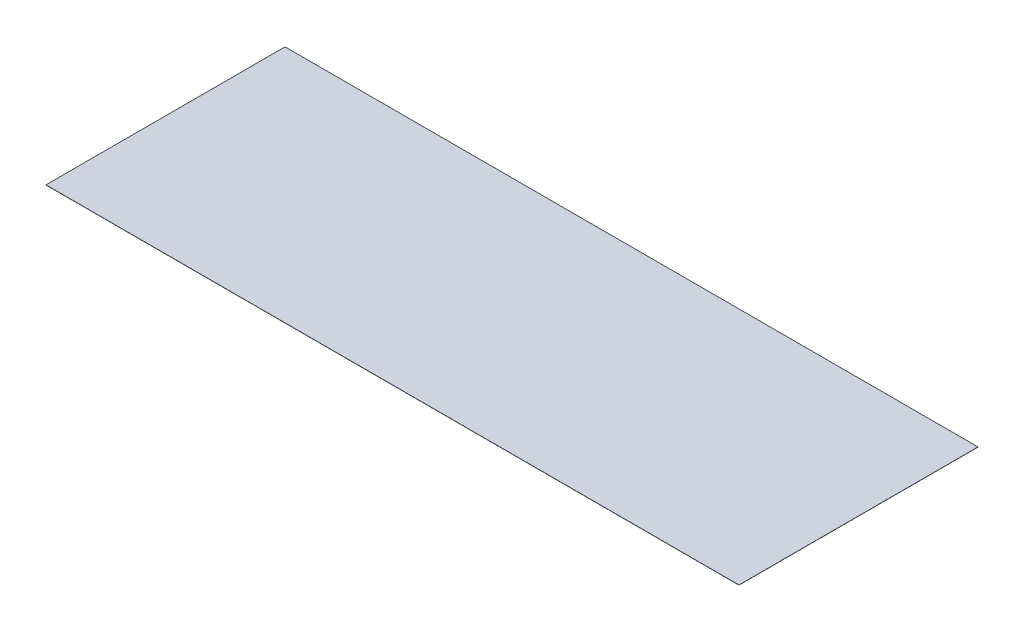
ISO-10303-21;
HEADER;
FILE_DESCRIPTION(('STEP AP214'),'2;1');
FILE_NAME('part.step','',(''),(''),'','','');
FILE_SCHEMA(('AUTOMOTIVE_DESIGN { 1 0 10303 214 1 1 1 1 }'));
ENDSEC;
DATA;
#1=APPLICATION_CONTEXT('core data for automotive mechanical design processes');
#2=APPLICATION_PROTOCOL_DEFINITION('international standard','automotive_design',2000,#1);
#3=PRODUCT_CONTEXT('',#1,'mechanical');
#4=PRODUCT('Part','Part','',(#3));
#5=PRODUCT_RELATED_PRODUCT_CATEGORY('part','',(#4));
#6=PRODUCT_DEFINITION_FORMATION('','',#4);
#7=PRODUCT_DEFINITION_CONTEXT('part definition',#1,'design');
#8=PRODUCT_DEFINITION('design','',#6,#7);
#9=PRODUCT_DEFINITION_SHAPE('','',#8);
#10=(LENGTH_UNIT() NAMED_UNIT(*) SI_UNIT(.MILLI.,.METRE.));
#11=(NAMED_UNIT(*) PLANE_ANGLE_UNIT() SI_UNIT($,.RADIAN.));
#12=(NAMED_UNIT(*) SI_UNIT($,.STERADIAN.) SOLID_ANGLE_UNIT());
#13=UNCERTAINTY_MEASURE_WITH_UNIT(LENGTH_MEASURE(1.E-05),#10,'distance_accuracy_value','');
#14=(GEOMETRIC_REPRESENTATION_CONTEXT(3) GLOBAL_UNCERTAINTY_ASSIGNED_CONTEXT((#13)) GLOBAL_UNIT_ASSIGNED_CONTEXT((#10,
#11,#12)) REPRESENTATION_CONTEXT('',''));
#15=CARTESIAN_POINT('',(0.,0.,0.));
#16=DIRECTION('',(0.,0.,1.));
#17=DIRECTION('',(1.,0.,0.));
#18=AXIS2_PLACEMENT_3D('',#15,#16,#17);
#19=CARTESIAN_POINT('',(3048.,1.5875,1051.306));
#20=DIRECTION('',(-1.,0.,0.));
#21=DIRECTION('',(0.,0.,1.));
#22=AXIS2_PLACEMENT_3D('',#19,#20,#21);
#23=PLANE('',#22);
#24=DIRECTION('',(0.,0.,-1.));
#25=VECTOR('',#24,1.);
#26=CARTESIAN_POINT('',(3048.,0.,1051.306));
#27=LINE('',#26,#25);
#28=CARTESIAN_POINT('',(3048.,0.,1051.306));
#29=VERTEX_POINT('',#28);
#30=CARTESIAN_POINT('',(3048.,0.,-1051.306));
#31=VERTEX_POINT('',#30);
#32=EDGE_CURVE('E102',#29,#31,#27,.T.);
#33=ORIENTED_EDGE('',*,*,#32,.T.);
#34=DIRECTION('',(0.,-1.,0.));
#35=VECTOR('',#34,1.);
#36=CARTESIAN_POINT('',(3048.,1.5875,-1051.306));
#37=LINE('',#36,#35);
#38=CARTESIAN_POINT('',(3048.,1.5875,-1051.306));
#39=VERTEX_POINT('',#38);
#40=EDGE_CURVE('E11',#39,#31,#37,.T.);
#41=ORIENTED_EDGE('',*,*,#40,.F.);
#42=DIRECTION('',(0.,0.,-1.));
#43=VECTOR('',#42,1.);
#44=CARTESIAN_POINT('',(3048.,1.5875,1051.306));
#45=LINE('',#44,#43);
#46=CARTESIAN_POINT('',(3048.,1.5875,1051.306));
#47=VERTEX_POINT('',#46);
#48=EDGE_CURVE('E90',#47,#39,#45,.T.);
#49=ORIENTED_EDGE('',*,*,#48,.F.);
#50=DIRECTION('',(0.,-1.,0.));
#51=VECTOR('',#50,1.);
#52=CARTESIAN_POINT('',(3048.,1.5875,1051.306));
#53=LINE('',#52,#51);
#54=EDGE_CURVE('E98',#47,#29,#53,.T.);
#55=ORIENTED_EDGE('',*,*,#54,.T.);
#56=EDGE_LOOP('',(#33,#41,#49,#55));
#57=FACE_BOUND('',#56,.T.);
#58=ADVANCED_FACE('F39',(#57),#23,.F.);
#59=CARTESIAN_POINT('',(-3048.,1.5875,-1051.306));
#60=DIRECTION('',(0.,0.,1.));
#61=DIRECTION('',(1.,0.,0.));
#62=AXIS2_PLACEMENT_3D('',#59,#60,#61);
#63=PLANE('',#62);
#64=DIRECTION('',(-1.,0.,0.));
#65=VECTOR('',#64,1.);
#66=CARTESIAN_POINT('',(-3048.,0.,-1051.306));
#67=LINE('',#66,#65);
#68=CARTESIAN_POINT('',(-3048.,0.,-1051.306));
#69=VERTEX_POINT('',#68);
#70=EDGE_CURVE('E94',#31,#69,#67,.T.);
#71=ORIENTED_EDGE('',*,*,#70,.T.);
#72=DIRECTION('',(0.,-1.,0.));
#73=VECTOR('',#72,1.);
#74=CARTESIAN_POINT('',(-3048.,1.5875,-1051.306));
#75=LINE('',#74,#73);
#76=CARTESIAN_POINT('',(-3048.,1.5875,-1051.306));
#77=VERTEX_POINT('',#76);
#78=EDGE_CURVE('E47',#77,#69,#75,.T.);
#79=ORIENTED_EDGE('',*,*,#78,.F.);
#80=DIRECTION('',(-1.,0.,0.));
#81=VECTOR('',#80,1.);
#82=CARTESIAN_POINT('',(-3048.,1.5875,-1051.306));
#83=LINE('',#82,#81);
#84=EDGE_CURVE('E85',#39,#77,#83,.T.);
#85=ORIENTED_EDGE('',*,*,#84,.F.);
#86=ORIENTED_EDGE('',*,*,#40,.T.);
#87=EDGE_LOOP('',(#71,#79,#85,#86));
#88=FACE_BOUND('',#87,.T.);
#89=ADVANCED_FACE('F93',(#88),#63,.F.);
#90=CARTESIAN_POINT('',(-3048.,1.5875,1051.306));
#91=DIRECTION('',(1.,0.,0.));
#92=DIRECTION('',(0.,0.,-1.));
#93=AXIS2_PLACEMENT_3D('',#90,#91,#92);
#94=PLANE('',#93);
#95=DIRECTION('',(0.,0.,1.));
#96=VECTOR('',#95,1.);
#97=CARTESIAN_POINT('',(-3048.,0.,1051.306));
#98=LINE('',#97,#96);
#99=CARTESIAN_POINT('',(-3048.,0.,1051.306));
#100=VERTEX_POINT('',#99);
#101=EDGE_CURVE('E72',#69,#100,#98,.T.);
#102=ORIENTED_EDGE('',*,*,#101,.T.);
#103=DIRECTION('',(0.,-1.,0.));
#104=VECTOR('',#103,1.);
#105=CARTESIAN_POINT('',(-3048.,1.5875,1051.306));
#106=LINE('',#105,#104);
#107=CARTESIAN_POINT('',(-3048.,1.5875,1051.306));
#108=VERTEX_POINT('',#107);
#109=EDGE_CURVE('E95',#108,#100,#106,.T.);
#110=ORIENTED_EDGE('',*,*,#109,.F.);
#111=DIRECTION('',(0.,0.,1.));
#112=VECTOR('',#111,1.);
#113=CARTESIAN_POINT('',(-3048.,1.5875,1051.306));
#114=LINE('',#113,#112);
#115=EDGE_CURVE('E88',#77,#108,#114,.T.);
#116=ORIENTED_EDGE('',*,*,#115,.F.);
#117=ORIENTED_EDGE('',*,*,#78,.T.);
#118=EDGE_LOOP('',(#102,#110,#116,#117));
#119=FACE_BOUND('',#118,.T.);
#120=ADVANCED_FACE('F96',(#119),#94,.F.);
#121=CARTESIAN_POINT('',(-3048.,1.5875,1051.306));
#122=DIRECTION('',(0.,0.,-1.));
#123=DIRECTION('',(-1.,0.,0.));
#124=AXIS2_PLACEMENT_3D('',#121,#122,#123);
#125=PLANE('',#124);
#126=DIRECTION('',(1.,0.,0.));
#127=VECTOR('',#126,1.);
#128=CARTESIAN_POINT('',(-3048.,0.,1051.306));
#129=LINE('',#128,#127);
#130=EDGE_CURVE('E78',#100,#29,#129,.T.);
#131=ORIENTED_EDGE('',*,*,#130,.T.);
#132=ORIENTED_EDGE('',*,*,#54,.F.);
#133=DIRECTION('',(1.,0.,0.));
#134=VECTOR('',#133,1.);
#135=CARTESIAN_POINT('',(-3048.,1.5875,1051.306));
#136=LINE('',#135,#134);
#137=EDGE_CURVE('E55',#108,#47,#136,.T.);
#138=ORIENTED_EDGE('',*,*,#137,.F.);
#139=ORIENTED_EDGE('',*,*,#109,.T.);
#140=EDGE_LOOP('',(#131,#132,#138,#139));
#141=FACE_BOUND('',#140,.T.);
#142=ADVANCED_FACE('F109',(#141),#125,.F.);
#143=CARTESIAN_POINT('',(0.,1.5875,0.));
#144=DIRECTION('',(0.,-1.,0.));
#145=DIRECTION('',(0.,0.,-1.));
#146=AXIS2_PLACEMENT_3D('',#143,#144,#145);
#147=PLANE('',#146);
#148=ORIENTED_EDGE('',*,*,#48,.T.);
#149=ORIENTED_EDGE('',*,*,#84,.T.);
#150=ORIENTED_EDGE('',*,*,#115,.T.);
#151=ORIENTED_EDGE('',*,*,#137,.T.);
#152=EDGE_LOOP('',(#148,#149,#150,#151));
#153=FACE_BOUND('',#152,.T.);
#154=ADVANCED_FACE('F86',(#153),#147,.F.);
#155=CARTESIAN_POINT('',(0.,0.,0.));
#156=DIRECTION('',(0.,-1.,0.));
#157=DIRECTION('',(0.,0.,-1.));
#158=AXIS2_PLACEMENT_3D('',#155,#156,#157);
#159=PLANE('',#158);
#160=ORIENTED_EDGE('',*,*,#32,.F.);
#161=ORIENTED_EDGE('',*,*,#130,.F.);
#162=ORIENTED_EDGE('',*,*,#101,.F.);
#163=ORIENTED_EDGE('',*,*,#70,.F.);
#164=EDGE_LOOP('',(#160,#161,#162,#163));
#165=FACE_BOUND('',#164,.T.);
#166=ADVANCED_FACE('F112',(#165),#159,.T.);
#167=CLOSED_SHELL('',(#58,#89,#120,#142,#154,#166));
#168=MANIFOLD_SOLID_BREP('B2',#167);
#169=ADVANCED_BREP_SHAPE_REPRESENTATION('',(#18,#168),#14);
#170=SHAPE_DEFINITION_REPRESENTATION(#9,#169);
ENDSEC;
END-ISO-10303-21;
